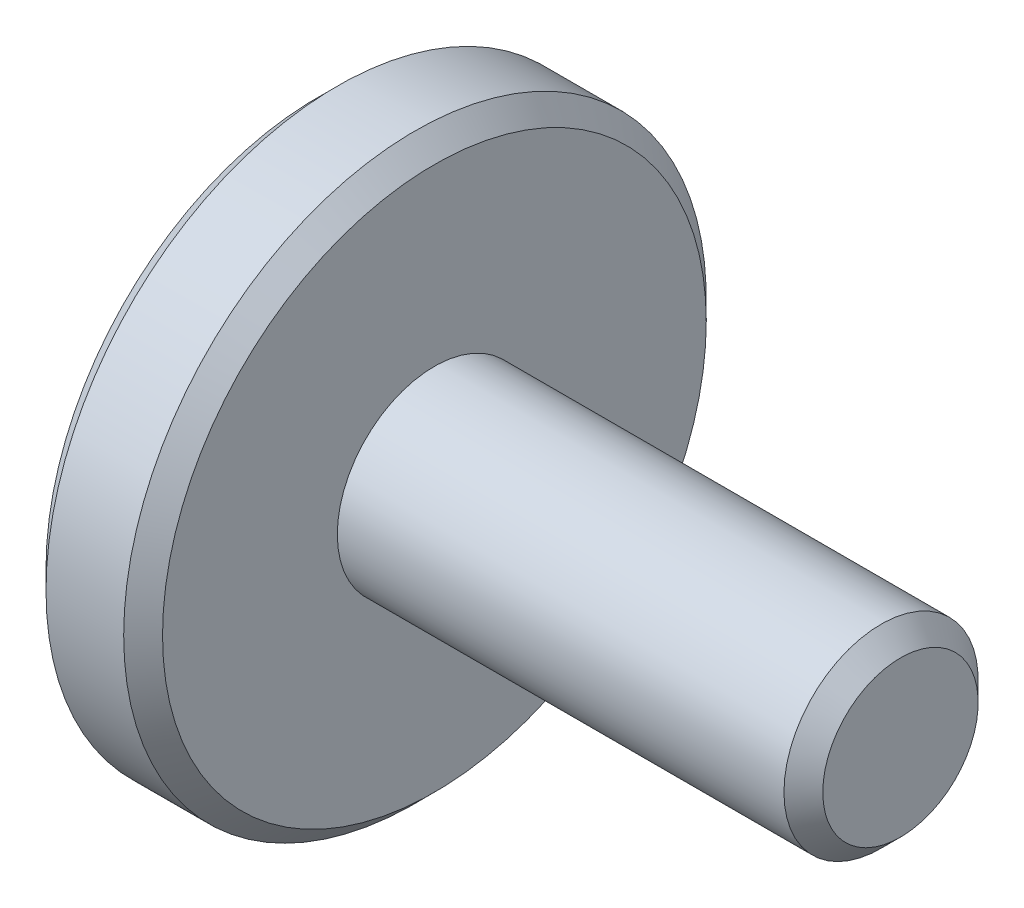
ISO-10303-21;
HEADER;
FILE_DESCRIPTION(('STEP AP214'),'2;1');
FILE_NAME('part.step','',(''),(''),'','','');
FILE_SCHEMA(('AUTOMOTIVE_DESIGN { 1 0 10303 214 1 1 1 1 }'));
ENDSEC;
DATA;
#1=APPLICATION_CONTEXT('core data for automotive mechanical design processes');
#2=APPLICATION_PROTOCOL_DEFINITION('international standard','automotive_design',2000,#1);
#3=PRODUCT_CONTEXT('',#1,'mechanical');
#4=PRODUCT('Part','Part','',(#3));
#5=PRODUCT_RELATED_PRODUCT_CATEGORY('part','',(#4));
#6=PRODUCT_DEFINITION_FORMATION('','',#4);
#7=PRODUCT_DEFINITION_CONTEXT('part definition',#1,'design');
#8=PRODUCT_DEFINITION('design','',#6,#7);
#9=PRODUCT_DEFINITION_SHAPE('','',#8);
#10=(LENGTH_UNIT() NAMED_UNIT(*) SI_UNIT(.MILLI.,.METRE.));
#11=(NAMED_UNIT(*) PLANE_ANGLE_UNIT() SI_UNIT($,.RADIAN.));
#12=(NAMED_UNIT(*) SI_UNIT($,.STERADIAN.) SOLID_ANGLE_UNIT());
#13=UNCERTAINTY_MEASURE_WITH_UNIT(LENGTH_MEASURE(1.E-05),#10,'distance_accuracy_value','');
#14=(GEOMETRIC_REPRESENTATION_CONTEXT(3) GLOBAL_UNCERTAINTY_ASSIGNED_CONTEXT((#13)) GLOBAL_UNIT_ASSIGNED_CONTEXT((#10,
#11,#12)) REPRESENTATION_CONTEXT('',''));
#15=CARTESIAN_POINT('',(0.,0.,0.));
#16=DIRECTION('',(0.,0.,1.));
#17=DIRECTION('',(1.,0.,0.));
#18=AXIS2_PLACEMENT_3D('',#15,#16,#17);
#19=CARTESIAN_POINT('',(0.,0.,0.));
#20=DIRECTION('',(1.,0.,0.));
#21=DIRECTION('',(0.,0.,-1.));
#22=AXIS2_PLACEMENT_3D('',#19,#20,#21);
#23=PLANE('',#22);
#24=CARTESIAN_POINT('',(0.,0.,0.));
#25=DIRECTION('',(1.,0.,0.));
#26=DIRECTION('',(0.,0.,-1.));
#27=AXIS2_PLACEMENT_3D('',#24,#25,#26);
#28=CIRCLE('',#27,7.00000000000001);
#29=CARTESIAN_POINT('',(0.,0.,-7.00000000000001));
#30=VERTEX_POINT('',#29);
#31=EDGE_CURVE('E55',#30,#30,#28,.F.);
#32=ORIENTED_EDGE('',*,*,#31,.T.);
#33=EDGE_LOOP('',(#32));
#34=FACE_BOUND('',#33,.T.);
#35=ADVANCED_FACE('F32',(#34),#23,.F.);
#36=CARTESIAN_POINT('',(-65.1704105238394,0.,0.));
#37=DIRECTION('',(-1.,0.,0.));
#38=DIRECTION('',(0.,0.,1.));
#39=AXIS2_PLACEMENT_3D('',#36,#37,#38);
#40=CYLINDRICAL_SURFACE('',#39,7.5);
#41=CARTESIAN_POINT('',(0.499999999999987,0.,0.));
#42=DIRECTION('',(1.,0.,0.));
#43=DIRECTION('',(0.,0.,-1.));
#44=AXIS2_PLACEMENT_3D('',#41,#42,#43);
#45=CIRCLE('',#44,7.5);
#46=CARTESIAN_POINT('',(0.499999999999987,0.,-7.5));
#47=VERTEX_POINT('',#46);
#48=EDGE_CURVE('E47',#47,#47,#45,.T.);
#49=ORIENTED_EDGE('',*,*,#48,.T.);
#50=EDGE_LOOP('',(#49));
#51=FACE_BOUND('',#50,.T.);
#52=CARTESIAN_POINT('',(2.5,0.,0.));
#53=DIRECTION('',(-1.,0.,0.));
#54=DIRECTION('',(0.,0.,1.));
#55=AXIS2_PLACEMENT_3D('',#52,#53,#54);
#56=CIRCLE('',#55,7.5);
#57=CARTESIAN_POINT('',(2.5,0.,7.5));
#58=VERTEX_POINT('',#57);
#59=EDGE_CURVE('E52',#58,#58,#56,.T.);
#60=ORIENTED_EDGE('',*,*,#59,.T.);
#61=EDGE_LOOP('',(#60));
#62=FACE_BOUND('',#61,.T.);
#63=ADVANCED_FACE('F74',(#51,#62),#40,.T.);
#64=CARTESIAN_POINT('',(3.,7.5,0.));
#65=DIRECTION('',(-1.,0.,0.));
#66=DIRECTION('',(0.,0.,1.));
#67=AXIS2_PLACEMENT_3D('',#64,#65,#66);
#68=PLANE('',#67);
#69=CARTESIAN_POINT('',(3.,0.,0.));
#70=DIRECTION('',(-1.,0.,0.));
#71=DIRECTION('',(0.,0.,1.));
#72=AXIS2_PLACEMENT_3D('',#69,#70,#71);
#73=CIRCLE('',#72,7.00000000000001);
#74=CARTESIAN_POINT('',(3.,0.,7.00000000000001));
#75=VERTEX_POINT('',#74);
#76=EDGE_CURVE('E43',#75,#75,#73,.F.);
#77=ORIENTED_EDGE('',*,*,#76,.T.);
#78=EDGE_LOOP('',(#77));
#79=FACE_BOUND('',#78,.T.);
#80=CARTESIAN_POINT('',(3.,0.,0.));
#81=DIRECTION('',(-1.,0.,0.));
#82=DIRECTION('',(0.,0.,1.));
#83=AXIS2_PLACEMENT_3D('',#80,#81,#82);
#84=CIRCLE('',#83,2.5);
#85=CARTESIAN_POINT('',(3.,0.,2.5));
#86=VERTEX_POINT('',#85);
#87=EDGE_CURVE('E58',#86,#86,#84,.T.);
#88=ORIENTED_EDGE('',*,*,#87,.T.);
#89=EDGE_LOOP('',(#88));
#90=FACE_BOUND('',#89,.T.);
#91=ADVANCED_FACE('F62',(#79,#90),#68,.F.);
#92=CARTESIAN_POINT('',(-65.1704105238394,0.,0.));
#93=DIRECTION('',(-1.,0.,0.));
#94=DIRECTION('',(0.,0.,1.));
#95=AXIS2_PLACEMENT_3D('',#92,#93,#94);
#96=CYLINDRICAL_SURFACE('',#95,2.5);
#97=CARTESIAN_POINT('',(14.5,0.,0.));
#98=DIRECTION('',(-1.,0.,0.));
#99=DIRECTION('',(0.,0.,1.));
#100=AXIS2_PLACEMENT_3D('',#97,#98,#99);
#101=CIRCLE('',#100,2.5);
#102=CARTESIAN_POINT('',(14.5,0.,2.5));
#103=VERTEX_POINT('',#102);
#104=EDGE_CURVE('E39',#103,#103,#101,.T.);
#105=ORIENTED_EDGE('',*,*,#104,.T.);
#106=EDGE_LOOP('',(#105));
#107=FACE_BOUND('',#106,.T.);
#108=ORIENTED_EDGE('',*,*,#87,.F.);
#109=EDGE_LOOP('',(#108));
#110=FACE_BOUND('',#109,.T.);
#111=ADVANCED_FACE('F64',(#107,#110),#96,.T.);
#112=CARTESIAN_POINT('',(15.,2.5,0.));
#113=DIRECTION('',(-1.,0.,0.));
#114=DIRECTION('',(0.,0.,1.));
#115=AXIS2_PLACEMENT_3D('',#112,#113,#114);
#116=PLANE('',#115);
#117=CARTESIAN_POINT('',(15.,0.,0.));
#118=DIRECTION('',(-1.,0.,0.));
#119=DIRECTION('',(0.,0.,1.));
#120=AXIS2_PLACEMENT_3D('',#117,#118,#119);
#121=CIRCLE('',#120,2.);
#122=CARTESIAN_POINT('',(15.,0.,2.));
#123=VERTEX_POINT('',#122);
#124=EDGE_CURVE('E10',#123,#123,#121,.F.);
#125=ORIENTED_EDGE('',*,*,#124,.T.);
#126=EDGE_LOOP('',(#125));
#127=FACE_BOUND('',#126,.T.);
#128=ADVANCED_FACE('F66',(#127),#116,.F.);
#129=CARTESIAN_POINT('',(0.,0.,0.));
#130=DIRECTION('',(1.,0.,0.));
#131=DIRECTION('',(0.,0.,-1.));
#132=AXIS2_PLACEMENT_3D('',#129,#130,#131);
#133=CONICAL_SURFACE('',#132,7.00000000000001,0.785398163397453);
#134=ORIENTED_EDGE('',*,*,#48,.F.);
#135=EDGE_LOOP('',(#134));
#136=FACE_BOUND('',#135,.T.);
#137=ORIENTED_EDGE('',*,*,#31,.F.);
#138=EDGE_LOOP('',(#137));
#139=FACE_BOUND('',#138,.T.);
#140=ADVANCED_FACE('F72',(#136,#139),#133,.T.);
#141=CARTESIAN_POINT('',(2.5,0.,0.));
#142=DIRECTION('',(-1.,0.,0.));
#143=DIRECTION('',(0.,0.,1.));
#144=AXIS2_PLACEMENT_3D('',#141,#142,#143);
#145=CONICAL_SURFACE('',#144,7.5,0.785398163397442);
#146=ORIENTED_EDGE('',*,*,#76,.F.);
#147=EDGE_LOOP('',(#146));
#148=FACE_BOUND('',#147,.T.);
#149=ORIENTED_EDGE('',*,*,#59,.F.);
#150=EDGE_LOOP('',(#149));
#151=FACE_BOUND('',#150,.T.);
#152=ADVANCED_FACE('F87',(#148,#151),#145,.T.);
#153=CARTESIAN_POINT('',(14.5,0.,0.));
#154=DIRECTION('',(-1.,0.,0.));
#155=DIRECTION('',(0.,0.,1.));
#156=AXIS2_PLACEMENT_3D('',#153,#154,#155);
#157=CONICAL_SURFACE('',#156,2.5,0.785398163397446);
#158=ORIENTED_EDGE('',*,*,#124,.F.);
#159=EDGE_LOOP('',(#158));
#160=FACE_BOUND('',#159,.T.);
#161=ORIENTED_EDGE('',*,*,#104,.F.);
#162=EDGE_LOOP('',(#161));
#163=FACE_BOUND('',#162,.T.);
#164=ADVANCED_FACE('F34',(#160,#163),#157,.T.);
#165=CLOSED_SHELL('',(#35,#63,#91,#111,#128,#140,#152,#164));
#166=MANIFOLD_SOLID_BREP('B2',#165);
#167=ADVANCED_BREP_SHAPE_REPRESENTATION('',(#18,#166),#14);
#168=SHAPE_DEFINITION_REPRESENTATION(#9,#167);
ENDSEC;
END-ISO-10303-21;
